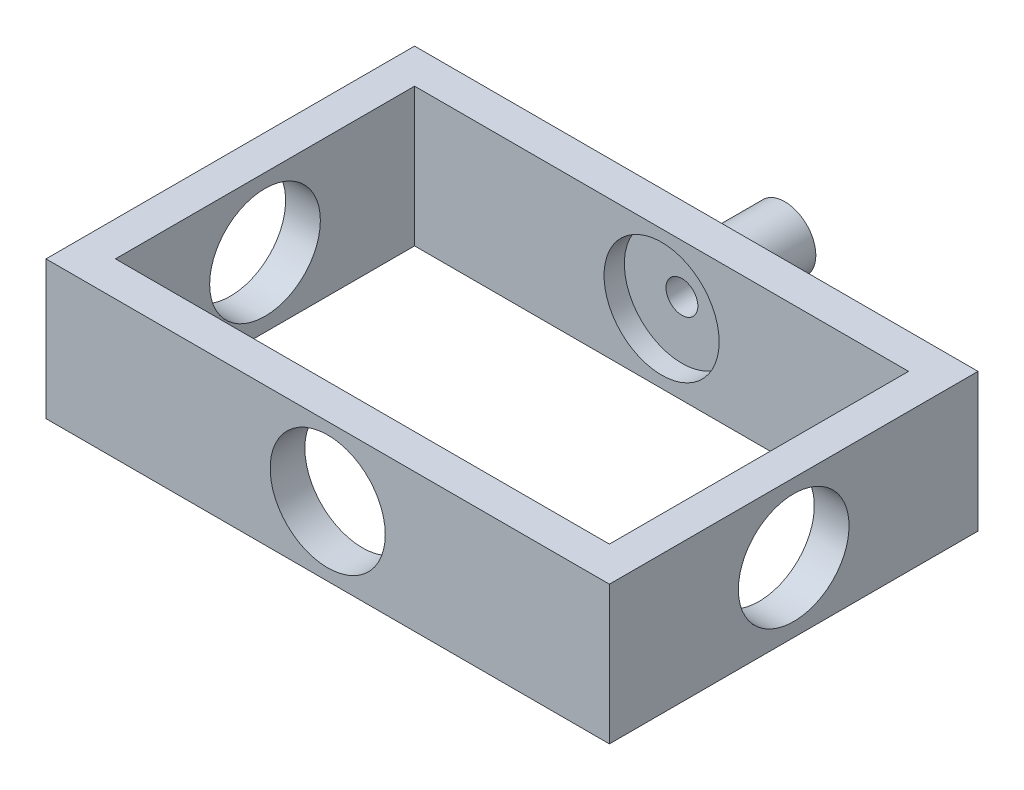
ISO-10303-21;
HEADER;
FILE_DESCRIPTION(('STEP AP214'),'2;1');
FILE_NAME('part.step','',(''),(''),'','','');
FILE_SCHEMA(('AUTOMOTIVE_DESIGN { 1 0 10303 214 1 1 1 1 }'));
ENDSEC;
DATA;
#1=APPLICATION_CONTEXT('core data for automotive mechanical design processes');
#2=APPLICATION_PROTOCOL_DEFINITION('international standard','automotive_design',2000,#1);
#3=PRODUCT_CONTEXT('',#1,'mechanical');
#4=PRODUCT('Part','Part','',(#3));
#5=PRODUCT_RELATED_PRODUCT_CATEGORY('part','',(#4));
#6=PRODUCT_DEFINITION_FORMATION('','',#4);
#7=PRODUCT_DEFINITION_CONTEXT('part definition',#1,'design');
#8=PRODUCT_DEFINITION('design','',#6,#7);
#9=PRODUCT_DEFINITION_SHAPE('','',#8);
#10=(LENGTH_UNIT() NAMED_UNIT(*) SI_UNIT(.MILLI.,.METRE.));
#11=(NAMED_UNIT(*) PLANE_ANGLE_UNIT() SI_UNIT($,.RADIAN.));
#12=(NAMED_UNIT(*) SI_UNIT($,.STERADIAN.) SOLID_ANGLE_UNIT());
#13=UNCERTAINTY_MEASURE_WITH_UNIT(LENGTH_MEASURE(1.E-05),#10,'distance_accuracy_value','');
#14=(GEOMETRIC_REPRESENTATION_CONTEXT(3) GLOBAL_UNCERTAINTY_ASSIGNED_CONTEXT((#13)) GLOBAL_UNIT_ASSIGNED_CONTEXT((#10,
#11,#12)) REPRESENTATION_CONTEXT('',''));
#15=CARTESIAN_POINT('',(0.,0.,0.));
#16=DIRECTION('',(0.,0.,1.));
#17=DIRECTION('',(1.,0.,0.));
#18=AXIS2_PLACEMENT_3D('',#15,#16,#17);
#19=CARTESIAN_POINT('',(-16.16075,7.9375,-10.57275));
#20=DIRECTION('',(0.,0.,1.));
#21=DIRECTION('',(1.,0.,0.));
#22=AXIS2_PLACEMENT_3D('',#19,#20,#21);
#23=PLANE('',#22);
#24=DIRECTION('',(-1.,0.,0.));
#25=VECTOR('',#24,1.);
#26=CARTESIAN_POINT('',(-16.16075,0.,-10.57275));
#27=LINE('',#26,#25);
#28=CARTESIAN_POINT('',(16.16075,0.,-10.57275));
#29=VERTEX_POINT('',#28);
#30=CARTESIAN_POINT('',(-16.16075,0.,-10.57275));
#31=VERTEX_POINT('',#30);
#32=EDGE_CURVE('E149',#29,#31,#27,.T.);
#33=ORIENTED_EDGE('',*,*,#32,.T.);
#34=DIRECTION('',(0.,-1.,0.));
#35=VECTOR('',#34,1.);
#36=CARTESIAN_POINT('',(-16.16075,7.9375,-10.57275));
#37=LINE('',#36,#35);
#38=CARTESIAN_POINT('',(-16.16075,7.9375,-10.57275));
#39=VERTEX_POINT('',#38);
#40=EDGE_CURVE('E159',#39,#31,#37,.T.);
#41=ORIENTED_EDGE('',*,*,#40,.F.);
#42=DIRECTION('',(-1.,0.,0.));
#43=VECTOR('',#42,1.);
#44=CARTESIAN_POINT('',(-16.16075,7.9375,-10.57275));
#45=LINE('',#44,#43);
#46=CARTESIAN_POINT('',(16.16075,7.9375,-10.57275));
#47=VERTEX_POINT('',#46);
#48=EDGE_CURVE('E139',#47,#39,#45,.T.);
#49=ORIENTED_EDGE('',*,*,#48,.F.);
#50=DIRECTION('',(0.,-1.,0.));
#51=VECTOR('',#50,1.);
#52=CARTESIAN_POINT('',(16.16075,7.9375,-10.57275));
#53=LINE('',#52,#51);
#54=EDGE_CURVE('E40',#47,#29,#53,.T.);
#55=ORIENTED_EDGE('',*,*,#54,.T.);
#56=EDGE_LOOP('',(#33,#41,#49,#55));
#57=FACE_BOUND('',#56,.T.);
#58=CARTESIAN_POINT('',(0.,3.96875,-10.57275));
#59=DIRECTION('',(0.,0.,1.));
#60=DIRECTION('',(1.,0.,0.));
#61=AXIS2_PLACEMENT_3D('',#58,#59,#60);
#62=CIRCLE('',#61,1.778);
#63=CARTESIAN_POINT('',(1.778,3.96875,-10.57275));
#64=VERTEX_POINT('',#63);
#65=EDGE_CURVE('E11',#64,#64,#62,.F.);
#66=ORIENTED_EDGE('',*,*,#65,.F.);
#67=EDGE_LOOP('',(#66));
#68=FACE_BOUND('',#67,.T.);
#69=ADVANCED_FACE('F32',(#57,#68),#23,.F.);
#70=CARTESIAN_POINT('',(0.,7.9375,0.));
#71=DIRECTION('',(0.,1.,0.));
#72=DIRECTION('',(0.,0.,1.));
#73=AXIS2_PLACEMENT_3D('',#70,#71,#72);
#74=PLANE('',#73);
#75=DIRECTION('',(0.,0.,-1.));
#76=VECTOR('',#75,1.);
#77=CARTESIAN_POINT('',(16.16075,7.9375,-10.57275));
#78=LINE('',#77,#76);
#79=CARTESIAN_POINT('',(16.16075,7.9375,10.57275));
#80=VERTEX_POINT('',#79);
#81=EDGE_CURVE('E136',#80,#47,#78,.T.);
#82=ORIENTED_EDGE('',*,*,#81,.T.);
#83=ORIENTED_EDGE('',*,*,#48,.T.);
#84=DIRECTION('',(0.,0.,1.));
#85=VECTOR('',#84,1.);
#86=CARTESIAN_POINT('',(-16.16075,7.9375,-10.57275));
#87=LINE('',#86,#85);
#88=CARTESIAN_POINT('',(-16.16075,7.9375,10.57275));
#89=VERTEX_POINT('',#88);
#90=EDGE_CURVE('E142',#39,#89,#87,.T.);
#91=ORIENTED_EDGE('',*,*,#90,.T.);
#92=DIRECTION('',(1.,0.,0.));
#93=VECTOR('',#92,1.);
#94=CARTESIAN_POINT('',(-16.16075,7.9375,10.57275));
#95=LINE('',#94,#93);
#96=EDGE_CURVE('E144',#89,#80,#95,.T.);
#97=ORIENTED_EDGE('',*,*,#96,.T.);
#98=EDGE_LOOP('',(#82,#83,#91,#97));
#99=FACE_BOUND('',#98,.T.);
#100=DIRECTION('',(-1.,0.,0.));
#101=VECTOR('',#100,1.);
#102=CARTESIAN_POINT('',(-14.16939,7.9375,-8.58139));
#103=LINE('',#102,#101);
#104=CARTESIAN_POINT('',(14.16939,7.9375,-8.58139));
#105=VERTEX_POINT('',#104);
#106=CARTESIAN_POINT('',(-14.16939,7.9375,-8.58139));
#107=VERTEX_POINT('',#106);
#108=EDGE_CURVE('E105',#105,#107,#103,.T.);
#109=ORIENTED_EDGE('',*,*,#108,.F.);
#110=DIRECTION('',(0.,0.,-1.));
#111=VECTOR('',#110,1.);
#112=CARTESIAN_POINT('',(14.16939,7.9375,-8.58139));
#113=LINE('',#112,#111);
#114=CARTESIAN_POINT('',(14.16939,7.9375,8.58139));
#115=VERTEX_POINT('',#114);
#116=EDGE_CURVE('E97',#115,#105,#113,.T.);
#117=ORIENTED_EDGE('',*,*,#116,.F.);
#118=DIRECTION('',(1.,0.,0.));
#119=VECTOR('',#118,1.);
#120=CARTESIAN_POINT('',(-14.16939,7.9375,8.58139));
#121=LINE('',#120,#119);
#122=CARTESIAN_POINT('',(-14.16939,7.9375,8.58139));
#123=VERTEX_POINT('',#122);
#124=EDGE_CURVE('E120',#123,#115,#121,.T.);
#125=ORIENTED_EDGE('',*,*,#124,.F.);
#126=DIRECTION('',(0.,0.,1.));
#127=VECTOR('',#126,1.);
#128=CARTESIAN_POINT('',(-14.16939,7.9375,-8.58139));
#129=LINE('',#128,#127);
#130=EDGE_CURVE('E118',#107,#123,#129,.T.);
#131=ORIENTED_EDGE('',*,*,#130,.F.);
#132=EDGE_LOOP('',(#109,#117,#125,#131));
#133=FACE_BOUND('',#132,.T.);
#134=ADVANCED_FACE('F117',(#99,#133),#74,.T.);
#135=CARTESIAN_POINT('',(0.,0.,0.));
#136=DIRECTION('',(0.,1.,0.));
#137=DIRECTION('',(0.,0.,1.));
#138=AXIS2_PLACEMENT_3D('',#135,#136,#137);
#139=PLANE('',#138);
#140=DIRECTION('',(0.,0.,-1.));
#141=VECTOR('',#140,1.);
#142=CARTESIAN_POINT('',(16.16075,0.,-10.57275));
#143=LINE('',#142,#141);
#144=CARTESIAN_POINT('',(16.16075,0.,10.57275));
#145=VERTEX_POINT('',#144);
#146=EDGE_CURVE('E113',#145,#29,#143,.T.);
#147=ORIENTED_EDGE('',*,*,#146,.F.);
#148=DIRECTION('',(1.,0.,0.));
#149=VECTOR('',#148,1.);
#150=CARTESIAN_POINT('',(-16.16075,0.,10.57275));
#151=LINE('',#150,#149);
#152=CARTESIAN_POINT('',(-16.16075,0.,10.57275));
#153=VERTEX_POINT('',#152);
#154=EDGE_CURVE('E140',#153,#145,#151,.T.);
#155=ORIENTED_EDGE('',*,*,#154,.F.);
#156=DIRECTION('',(0.,0.,1.));
#157=VECTOR('',#156,1.);
#158=CARTESIAN_POINT('',(-16.16075,0.,-10.57275));
#159=LINE('',#158,#157);
#160=EDGE_CURVE('E151',#31,#153,#159,.T.);
#161=ORIENTED_EDGE('',*,*,#160,.F.);
#162=ORIENTED_EDGE('',*,*,#32,.F.);
#163=EDGE_LOOP('',(#147,#155,#161,#162));
#164=FACE_BOUND('',#163,.T.);
#165=DIRECTION('',(0.,0.,-1.));
#166=VECTOR('',#165,1.);
#167=CARTESIAN_POINT('',(14.16939,0.,-8.58139));
#168=LINE('',#167,#166);
#169=CARTESIAN_POINT('',(14.16939,0.,8.58139));
#170=VERTEX_POINT('',#169);
#171=CARTESIAN_POINT('',(14.16939,0.,-8.58139));
#172=VERTEX_POINT('',#171);
#173=EDGE_CURVE('E55',#170,#172,#168,.T.);
#174=ORIENTED_EDGE('',*,*,#173,.T.);
#175=DIRECTION('',(-1.,0.,0.));
#176=VECTOR('',#175,1.);
#177=CARTESIAN_POINT('',(-14.16939,0.,-8.58139));
#178=LINE('',#177,#176);
#179=CARTESIAN_POINT('',(-14.16939,0.,-8.58139));
#180=VERTEX_POINT('',#179);
#181=EDGE_CURVE('E112',#172,#180,#178,.T.);
#182=ORIENTED_EDGE('',*,*,#181,.T.);
#183=DIRECTION('',(0.,0.,1.));
#184=VECTOR('',#183,1.);
#185=CARTESIAN_POINT('',(-14.16939,0.,-8.58139));
#186=LINE('',#185,#184);
#187=CARTESIAN_POINT('',(-14.16939,0.,8.58139));
#188=VERTEX_POINT('',#187);
#189=EDGE_CURVE('E128',#180,#188,#186,.T.);
#190=ORIENTED_EDGE('',*,*,#189,.T.);
#191=DIRECTION('',(1.,0.,0.));
#192=VECTOR('',#191,1.);
#193=CARTESIAN_POINT('',(-14.16939,0.,8.58139));
#194=LINE('',#193,#192);
#195=EDGE_CURVE('E106',#188,#170,#194,.T.);
#196=ORIENTED_EDGE('',*,*,#195,.T.);
#197=EDGE_LOOP('',(#174,#182,#190,#196));
#198=FACE_BOUND('',#197,.T.);
#199=ADVANCED_FACE('F215',(#164,#198),#139,.F.);
#200=CARTESIAN_POINT('',(16.16075,7.9375,-10.57275));
#201=DIRECTION('',(-1.,0.,0.));
#202=DIRECTION('',(0.,0.,1.));
#203=AXIS2_PLACEMENT_3D('',#200,#201,#202);
#204=PLANE('',#203);
#205=CARTESIAN_POINT('',(16.16075,3.96875,0.));
#206=DIRECTION('',(-1.,0.,0.));
#207=DIRECTION('',(0.,0.,1.));
#208=AXIS2_PLACEMENT_3D('',#205,#206,#207);
#209=CIRCLE('',#208,3.175);
#210=CARTESIAN_POINT('',(16.16075,3.96875,3.175));
#211=VERTEX_POINT('',#210);
#212=EDGE_CURVE('E126',#211,#211,#209,.T.);
#213=ORIENTED_EDGE('',*,*,#212,.T.);
#214=EDGE_LOOP('',(#213));
#215=FACE_BOUND('',#214,.T.);
#216=ORIENTED_EDGE('',*,*,#146,.T.);
#217=ORIENTED_EDGE('',*,*,#54,.F.);
#218=ORIENTED_EDGE('',*,*,#81,.F.);
#219=DIRECTION('',(0.,-1.,0.));
#220=VECTOR('',#219,1.);
#221=CARTESIAN_POINT('',(16.16075,7.9375,10.57275));
#222=LINE('',#221,#220);
#223=EDGE_CURVE('E146',#80,#145,#222,.T.);
#224=ORIENTED_EDGE('',*,*,#223,.T.);
#225=EDGE_LOOP('',(#216,#217,#218,#224));
#226=FACE_BOUND('',#225,.T.);
#227=ADVANCED_FACE('F34',(#215,#226),#204,.F.);
#228=CARTESIAN_POINT('',(-16.16075,7.9375,-10.57275));
#229=DIRECTION('',(1.,0.,0.));
#230=DIRECTION('',(0.,0.,-1.));
#231=AXIS2_PLACEMENT_3D('',#228,#229,#230);
#232=PLANE('',#231);
#233=CARTESIAN_POINT('',(-16.16075,3.96875,0.));
#234=DIRECTION('',(-1.,0.,0.));
#235=DIRECTION('',(0.,0.,1.));
#236=AXIS2_PLACEMENT_3D('',#233,#234,#235);
#237=CIRCLE('',#236,3.175);
#238=CARTESIAN_POINT('',(-16.16075,3.96875,3.175));
#239=VERTEX_POINT('',#238);
#240=EDGE_CURVE('E167',#239,#239,#237,.T.);
#241=ORIENTED_EDGE('',*,*,#240,.F.);
#242=EDGE_LOOP('',(#241));
#243=FACE_BOUND('',#242,.T.);
#244=ORIENTED_EDGE('',*,*,#160,.T.);
#245=DIRECTION('',(0.,-1.,0.));
#246=VECTOR('',#245,1.);
#247=CARTESIAN_POINT('',(-16.16075,7.9375,10.57275));
#248=LINE('',#247,#246);
#249=EDGE_CURVE('E156',#89,#153,#248,.T.);
#250=ORIENTED_EDGE('',*,*,#249,.F.);
#251=ORIENTED_EDGE('',*,*,#90,.F.);
#252=ORIENTED_EDGE('',*,*,#40,.T.);
#253=EDGE_LOOP('',(#244,#250,#251,#252));
#254=FACE_BOUND('',#253,.T.);
#255=ADVANCED_FACE('F220',(#243,#254),#232,.F.);
#256=CARTESIAN_POINT('',(-16.16075,7.9375,10.57275));
#257=DIRECTION('',(0.,0.,-1.));
#258=DIRECTION('',(-1.,0.,0.));
#259=AXIS2_PLACEMENT_3D('',#256,#257,#258);
#260=PLANE('',#259);
#261=CARTESIAN_POINT('',(0.,3.96875,10.57275));
#262=DIRECTION('',(0.,0.,1.));
#263=DIRECTION('',(1.,0.,0.));
#264=AXIS2_PLACEMENT_3D('',#261,#262,#263);
#265=CIRCLE('',#264,3.302);
#266=CARTESIAN_POINT('',(3.302,3.96875,10.57275));
#267=VERTEX_POINT('',#266);
#268=EDGE_CURVE('E177',#267,#267,#265,.T.);
#269=ORIENTED_EDGE('',*,*,#268,.F.);
#270=EDGE_LOOP('',(#269));
#271=FACE_BOUND('',#270,.T.);
#272=ORIENTED_EDGE('',*,*,#154,.T.);
#273=ORIENTED_EDGE('',*,*,#223,.F.);
#274=ORIENTED_EDGE('',*,*,#96,.F.);
#275=ORIENTED_EDGE('',*,*,#249,.T.);
#276=EDGE_LOOP('',(#272,#273,#274,#275));
#277=FACE_BOUND('',#276,.T.);
#278=ADVANCED_FACE('F223',(#271,#277),#260,.F.);
#279=CARTESIAN_POINT('',(14.16939,7.9375,-8.58139));
#280=DIRECTION('',(-1.,0.,0.));
#281=DIRECTION('',(0.,0.,1.));
#282=AXIS2_PLACEMENT_3D('',#279,#280,#281);
#283=PLANE('',#282);
#284=CARTESIAN_POINT('',(14.16939,3.96875,0.));
#285=DIRECTION('',(-1.,0.,0.));
#286=DIRECTION('',(0.,0.,1.));
#287=AXIS2_PLACEMENT_3D('',#284,#285,#286);
#288=CIRCLE('',#287,3.175);
#289=CARTESIAN_POINT('',(14.16939,3.96875,3.175));
#290=VERTEX_POINT('',#289);
#291=EDGE_CURVE('E166',#290,#290,#288,.T.);
#292=ORIENTED_EDGE('',*,*,#291,.F.);
#293=EDGE_LOOP('',(#292));
#294=FACE_BOUND('',#293,.T.);
#295=ORIENTED_EDGE('',*,*,#173,.F.);
#296=DIRECTION('',(0.,-1.,0.));
#297=VECTOR('',#296,1.);
#298=CARTESIAN_POINT('',(14.16939,7.9375,8.58139));
#299=LINE('',#298,#297);
#300=EDGE_CURVE('E101',#115,#170,#299,.T.);
#301=ORIENTED_EDGE('',*,*,#300,.F.);
#302=ORIENTED_EDGE('',*,*,#116,.T.);
#303=DIRECTION('',(0.,-1.,0.));
#304=VECTOR('',#303,1.);
#305=CARTESIAN_POINT('',(14.16939,7.9375,-8.58139));
#306=LINE('',#305,#304);
#307=EDGE_CURVE('E100',#105,#172,#306,.T.);
#308=ORIENTED_EDGE('',*,*,#307,.T.);
#309=EDGE_LOOP('',(#295,#301,#302,#308));
#310=FACE_BOUND('',#309,.T.);
#311=ADVANCED_FACE('F99',(#294,#310),#283,.T.);
#312=CARTESIAN_POINT('',(-14.16939,7.9375,-8.58139));
#313=DIRECTION('',(0.,0.,1.));
#314=DIRECTION('',(1.,0.,0.));
#315=AXIS2_PLACEMENT_3D('',#312,#313,#314);
#316=PLANE('',#315);
#317=CARTESIAN_POINT('',(0.,3.96875,-8.58139));
#318=DIRECTION('',(0.,0.,1.));
#319=DIRECTION('',(1.,0.,0.));
#320=AXIS2_PLACEMENT_3D('',#317,#318,#319);
#321=CIRCLE('',#320,3.302);
#322=CARTESIAN_POINT('',(3.302,3.96875,-8.58139));
#323=VERTEX_POINT('',#322);
#324=EDGE_CURVE('E170',#323,#323,#321,.T.);
#325=ORIENTED_EDGE('',*,*,#324,.F.);
#326=EDGE_LOOP('',(#325));
#327=FACE_BOUND('',#326,.T.);
#328=ORIENTED_EDGE('',*,*,#181,.F.);
#329=ORIENTED_EDGE('',*,*,#307,.F.);
#330=ORIENTED_EDGE('',*,*,#108,.T.);
#331=DIRECTION('',(0.,-1.,0.));
#332=VECTOR('',#331,1.);
#333=CARTESIAN_POINT('',(-14.16939,7.9375,-8.58139));
#334=LINE('',#333,#332);
#335=EDGE_CURVE('E114',#107,#180,#334,.T.);
#336=ORIENTED_EDGE('',*,*,#335,.T.);
#337=EDGE_LOOP('',(#328,#329,#330,#336));
#338=FACE_BOUND('',#337,.T.);
#339=ADVANCED_FACE('F109',(#327,#338),#316,.T.);
#340=CARTESIAN_POINT('',(-14.16939,7.9375,-8.58139));
#341=DIRECTION('',(1.,0.,0.));
#342=DIRECTION('',(0.,0.,-1.));
#343=AXIS2_PLACEMENT_3D('',#340,#341,#342);
#344=PLANE('',#343);
#345=CARTESIAN_POINT('',(-14.16939,3.96875,0.));
#346=DIRECTION('',(1.,0.,0.));
#347=DIRECTION('',(0.,0.,-1.));
#348=AXIS2_PLACEMENT_3D('',#345,#346,#347);
#349=CIRCLE('',#348,3.175);
#350=CARTESIAN_POINT('',(-14.16939,3.96875,-3.175));
#351=VERTEX_POINT('',#350);
#352=EDGE_CURVE('E164',#351,#351,#349,.T.);
#353=ORIENTED_EDGE('',*,*,#352,.F.);
#354=EDGE_LOOP('',(#353));
#355=FACE_BOUND('',#354,.T.);
#356=ORIENTED_EDGE('',*,*,#189,.F.);
#357=ORIENTED_EDGE('',*,*,#335,.F.);
#358=ORIENTED_EDGE('',*,*,#130,.T.);
#359=DIRECTION('',(0.,-1.,0.));
#360=VECTOR('',#359,1.);
#361=CARTESIAN_POINT('',(-14.16939,7.9375,8.58139));
#362=LINE('',#361,#360);
#363=EDGE_CURVE('E47',#123,#188,#362,.T.);
#364=ORIENTED_EDGE('',*,*,#363,.T.);
#365=EDGE_LOOP('',(#356,#357,#358,#364));
#366=FACE_BOUND('',#365,.T.);
#367=ADVANCED_FACE('F236',(#355,#366),#344,.T.);
#368=CARTESIAN_POINT('',(-14.16939,7.9375,8.58139));
#369=DIRECTION('',(0.,0.,-1.));
#370=DIRECTION('',(-1.,0.,0.));
#371=AXIS2_PLACEMENT_3D('',#368,#369,#370);
#372=PLANE('',#371);
#373=CARTESIAN_POINT('',(0.,3.96875,8.58139));
#374=DIRECTION('',(0.,0.,-1.));
#375=DIRECTION('',(-1.,0.,0.));
#376=AXIS2_PLACEMENT_3D('',#373,#374,#375);
#377=CIRCLE('',#376,3.302);
#378=CARTESIAN_POINT('',(-3.302,3.96875,8.58139));
#379=VERTEX_POINT('',#378);
#380=EDGE_CURVE('E168',#379,#379,#377,.T.);
#381=ORIENTED_EDGE('',*,*,#380,.F.);
#382=EDGE_LOOP('',(#381));
#383=FACE_BOUND('',#382,.T.);
#384=ORIENTED_EDGE('',*,*,#195,.F.);
#385=ORIENTED_EDGE('',*,*,#363,.F.);
#386=ORIENTED_EDGE('',*,*,#124,.T.);
#387=ORIENTED_EDGE('',*,*,#300,.T.);
#388=EDGE_LOOP('',(#384,#385,#386,#387));
#389=FACE_BOUND('',#388,.T.);
#390=ADVANCED_FACE('F207',(#383,#389),#372,.T.);
#391=CARTESIAN_POINT('',(20.98675,3.96875,0.));
#392=DIRECTION('',(-1.,0.,0.));
#393=DIRECTION('',(0.,0.,1.));
#394=AXIS2_PLACEMENT_3D('',#391,#392,#393);
#395=CYLINDRICAL_SURFACE('',#394,3.175);
#396=ORIENTED_EDGE('',*,*,#352,.T.);
#397=EDGE_LOOP('',(#396));
#398=FACE_BOUND('',#397,.T.);
#399=ORIENTED_EDGE('',*,*,#240,.T.);
#400=EDGE_LOOP('',(#399));
#401=FACE_BOUND('',#400,.T.);
#402=ADVANCED_FACE('F198',(#398,#401),#395,.F.);
#403=ORIENTED_EDGE('',*,*,#291,.T.);
#404=EDGE_LOOP('',(#403));
#405=FACE_BOUND('',#404,.T.);
#406=ORIENTED_EDGE('',*,*,#212,.F.);
#407=EDGE_LOOP('',(#406));
#408=FACE_BOUND('',#407,.T.);
#409=ADVANCED_FACE('F195',(#405,#408),#395,.F.);
#410=CARTESIAN_POINT('',(0.,3.96875,-9.74725));
#411=DIRECTION('',(0.,0.,1.));
#412=DIRECTION('',(1.,0.,0.));
#413=AXIS2_PLACEMENT_3D('',#410,#411,#412);
#414=CYLINDRICAL_SURFACE('',#413,3.302);
#415=ORIENTED_EDGE('',*,*,#380,.T.);
#416=EDGE_LOOP('',(#415));
#417=FACE_BOUND('',#416,.T.);
#418=ORIENTED_EDGE('',*,*,#268,.T.);
#419=EDGE_LOOP('',(#418));
#420=FACE_BOUND('',#419,.T.);
#421=ADVANCED_FACE('F197',(#417,#420),#414,.F.);
#422=ORIENTED_EDGE('',*,*,#324,.T.);
#423=EDGE_LOOP('',(#422));
#424=FACE_BOUND('',#423,.T.);
#425=CARTESIAN_POINT('',(0.,3.96875,-9.74725));
#426=DIRECTION('',(0.,0.,1.));
#427=DIRECTION('',(1.,0.,0.));
#428=AXIS2_PLACEMENT_3D('',#425,#426,#427);
#429=CIRCLE('',#428,3.302);
#430=CARTESIAN_POINT('',(3.302,3.96875,-9.74725));
#431=VERTEX_POINT('',#430);
#432=EDGE_CURVE('E171',#431,#431,#429,.T.);
#433=ORIENTED_EDGE('',*,*,#432,.F.);
#434=EDGE_LOOP('',(#433));
#435=FACE_BOUND('',#434,.T.);
#436=ADVANCED_FACE('F205',(#424,#435),#414,.F.);
#437=CARTESIAN_POINT('',(0.,3.96875,-9.74725));
#438=DIRECTION('',(0.,0.,1.));
#439=DIRECTION('',(1.,0.,0.));
#440=AXIS2_PLACEMENT_3D('',#437,#438,#439);
#441=PLANE('',#440);
#442=CARTESIAN_POINT('',(0.,3.96875,-9.74725));
#443=DIRECTION('',(0.,0.,1.));
#444=DIRECTION('',(1.,0.,0.));
#445=AXIS2_PLACEMENT_3D('',#442,#443,#444);
#446=CIRCLE('',#445,0.9144);
#447=CARTESIAN_POINT('',(0.9144,3.96875,-9.74725));
#448=VERTEX_POINT('',#447);
#449=EDGE_CURVE('E371',#448,#448,#446,.T.);
#450=ORIENTED_EDGE('',*,*,#449,.F.);
#451=EDGE_LOOP('',(#450));
#452=FACE_BOUND('',#451,.T.);
#453=ORIENTED_EDGE('',*,*,#432,.T.);
#454=EDGE_LOOP('',(#453));
#455=FACE_BOUND('',#454,.T.);
#456=ADVANCED_FACE('F321',(#452,#455),#441,.T.);
#457=CARTESIAN_POINT('',(0.,3.96875,-15.65275));
#458=DIRECTION('',(0.,0.,1.));
#459=DIRECTION('',(1.,0.,0.));
#460=AXIS2_PLACEMENT_3D('',#457,#458,#459);
#461=CYLINDRICAL_SURFACE('',#460,1.778);
#462=CARTESIAN_POINT('',(0.,3.96875,-15.65275));
#463=DIRECTION('',(0.,0.,-1.));
#464=DIRECTION('',(-1.,0.,0.));
#465=AXIS2_PLACEMENT_3D('',#462,#463,#464);
#466=CIRCLE('',#465,1.778);
#467=CARTESIAN_POINT('',(-1.778,3.96875,-15.65275));
#468=VERTEX_POINT('',#467);
#469=EDGE_CURVE('E182',#468,#468,#466,.T.);
#470=ORIENTED_EDGE('',*,*,#469,.F.);
#471=EDGE_LOOP('',(#470));
#472=FACE_BOUND('',#471,.T.);
#473=ORIENTED_EDGE('',*,*,#65,.T.);
#474=EDGE_LOOP('',(#473));
#475=FACE_BOUND('',#474,.T.);
#476=ADVANCED_FACE('F329',(#472,#475),#461,.T.);
#477=CARTESIAN_POINT('',(0.,3.96875,-15.65275));
#478=DIRECTION('',(0.,0.,-1.));
#479=DIRECTION('',(-1.,0.,0.));
#480=AXIS2_PLACEMENT_3D('',#477,#478,#479);
#481=PLANE('',#480);
#482=CARTESIAN_POINT('',(0.,3.96875,-15.65275));
#483=DIRECTION('',(0.,0.,-1.));
#484=DIRECTION('',(-1.,0.,0.));
#485=AXIS2_PLACEMENT_3D('',#482,#483,#484);
#486=CIRCLE('',#485,0.9144);
#487=CARTESIAN_POINT('',(-0.9144,3.96875,-15.65275));
#488=VERTEX_POINT('',#487);
#489=EDGE_CURVE('E374',#488,#488,#486,.T.);
#490=ORIENTED_EDGE('',*,*,#489,.F.);
#491=EDGE_LOOP('',(#490));
#492=FACE_BOUND('',#491,.T.);
#493=ORIENTED_EDGE('',*,*,#469,.T.);
#494=EDGE_LOOP('',(#493));
#495=FACE_BOUND('',#494,.T.);
#496=ADVANCED_FACE('F343',(#492,#495),#481,.T.);
#497=CARTESIAN_POINT('',(0.,3.96875,-4.73074999999999));
#498=DIRECTION('',(0.,0.,-1.));
#499=DIRECTION('',(-1.,0.,0.));
#500=AXIS2_PLACEMENT_3D('',#497,#498,#499);
#501=CYLINDRICAL_SURFACE('',#500,0.9144);
#502=ORIENTED_EDGE('',*,*,#449,.T.);
#503=EDGE_LOOP('',(#502));
#504=FACE_BOUND('',#503,.T.);
#505=ORIENTED_EDGE('',*,*,#489,.T.);
#506=EDGE_LOOP('',(#505));
#507=FACE_BOUND('',#506,.T.);
#508=ADVANCED_FACE('F351',(#504,#507),#501,.F.);
#509=CLOSED_SHELL('',(#69,#134,#199,#227,#255,#278,#311,#339,#367,#390,#402,#409,#421,#436,#456,
#476,#496,#508));
#510=MANIFOLD_SOLID_BREP('B2',#509);
#511=ADVANCED_BREP_SHAPE_REPRESENTATION('',(#18,#510),#14);
#512=SHAPE_DEFINITION_REPRESENTATION(#9,#511);
ENDSEC;
END-ISO-10303-21;
